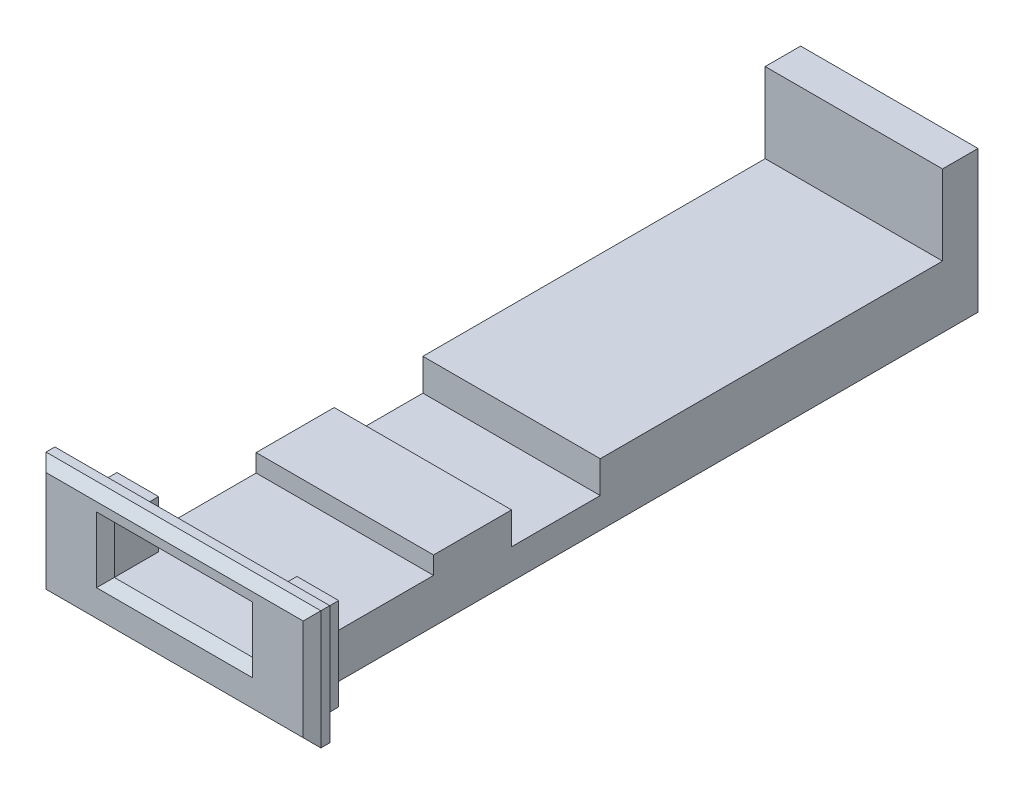
ISO-10303-21;
HEADER;
FILE_DESCRIPTION(('STEP AP214'),'2;1');
FILE_NAME('part.step','',(''),(''),'','','');
FILE_SCHEMA(('AUTOMOTIVE_DESIGN { 1 0 10303 214 1 1 1 1 }'));
ENDSEC;
DATA;
#1=APPLICATION_CONTEXT('core data for automotive mechanical design processes');
#2=APPLICATION_PROTOCOL_DEFINITION('international standard','automotive_design',2000,#1);
#3=PRODUCT_CONTEXT('',#1,'mechanical');
#4=PRODUCT('Part','Part','',(#3));
#5=PRODUCT_RELATED_PRODUCT_CATEGORY('part','',(#4));
#6=PRODUCT_DEFINITION_FORMATION('','',#4);
#7=PRODUCT_DEFINITION_CONTEXT('part definition',#1,'design');
#8=PRODUCT_DEFINITION('design','',#6,#7);
#9=PRODUCT_DEFINITION_SHAPE('','',#8);
#10=(LENGTH_UNIT() NAMED_UNIT(*) SI_UNIT(.MILLI.,.METRE.));
#11=(NAMED_UNIT(*) PLANE_ANGLE_UNIT() SI_UNIT($,.RADIAN.));
#12=(NAMED_UNIT(*) SI_UNIT($,.STERADIAN.) SOLID_ANGLE_UNIT());
#13=UNCERTAINTY_MEASURE_WITH_UNIT(LENGTH_MEASURE(1.E-05),#10,'distance_accuracy_value','');
#14=(GEOMETRIC_REPRESENTATION_CONTEXT(3) GLOBAL_UNCERTAINTY_ASSIGNED_CONTEXT((#13)) GLOBAL_UNIT_ASSIGNED_CONTEXT((#10,
#11,#12)) REPRESENTATION_CONTEXT('',''));
#15=CARTESIAN_POINT('',(0.,0.,0.));
#16=DIRECTION('',(0.,0.,1.));
#17=DIRECTION('',(1.,0.,0.));
#18=AXIS2_PLACEMENT_3D('',#15,#16,#17);
#19=CARTESIAN_POINT('',(7.75,2.5,-3.));
#20=DIRECTION('',(0.,0.,1.));
#21=DIRECTION('',(1.,0.,0.));
#22=AXIS2_PLACEMENT_3D('',#19,#20,#21);
#23=PLANE('',#22);
#24=DIRECTION('',(-1.,0.,0.));
#25=VECTOR('',#24,1.);
#26=CARTESIAN_POINT('',(7.75,5.2,-3.));
#27=LINE('',#26,#25);
#28=CARTESIAN_POINT('',(-3.9,5.2,-3.));
#29=VERTEX_POINT('',#28);
#30=CARTESIAN_POINT('',(-6.24999999999999,5.2,-3.));
#31=VERTEX_POINT('',#30);
#32=EDGE_CURVE('E314',#29,#31,#27,.T.);
#33=ORIENTED_EDGE('',*,*,#32,.F.);
#34=DIRECTION('',(0.,1.,0.));
#35=VECTOR('',#34,1.);
#36=CARTESIAN_POINT('',(-3.9,2.5,-3.));
#37=LINE('',#36,#35);
#38=CARTESIAN_POINT('',(-3.9,2.5,-3.));
#39=VERTEX_POINT('',#38);
#40=EDGE_CURVE('E299',#39,#29,#37,.T.);
#41=ORIENTED_EDGE('',*,*,#40,.F.);
#42=DIRECTION('',(-1.,0.,0.));
#43=VECTOR('',#42,1.);
#44=CARTESIAN_POINT('',(7.75,2.5,-3.));
#45=LINE('',#44,#43);
#46=CARTESIAN_POINT('',(-4.99999999999999,2.5,-3.));
#47=VERTEX_POINT('',#46);
#48=EDGE_CURVE('E328',#39,#47,#45,.T.);
#49=ORIENTED_EDGE('',*,*,#48,.T.);
#50=DIRECTION('',(0.,-1.,0.));
#51=VECTOR('',#50,1.);
#52=CARTESIAN_POINT('',(-4.99999999999999,8.,-3.));
#53=LINE('',#52,#51);
#54=CARTESIAN_POINT('',(-4.99999999999999,0.,-3.));
#55=VERTEX_POINT('',#54);
#56=EDGE_CURVE('E489',#47,#55,#53,.T.);
#57=ORIENTED_EDGE('',*,*,#56,.T.);
#58=DIRECTION('',(-1.,0.,0.));
#59=VECTOR('',#58,1.);
#60=CARTESIAN_POINT('',(-6.24999999999999,0.,-3.));
#61=LINE('',#60,#59);
#62=CARTESIAN_POINT('',(-6.24999999999999,0.,-3.));
#63=VERTEX_POINT('',#62);
#64=EDGE_CURVE('E458',#55,#63,#61,.T.);
#65=ORIENTED_EDGE('',*,*,#64,.T.);
#66=DIRECTION('',(0.,-1.,0.));
#67=VECTOR('',#66,1.);
#68=CARTESIAN_POINT('',(-6.24999999999999,8.,-3.));
#69=LINE('',#68,#67);
#70=EDGE_CURVE('E322',#31,#63,#69,.T.);
#71=ORIENTED_EDGE('',*,*,#70,.F.);
#72=EDGE_LOOP('',(#33,#41,#49,#57,#65,#71));
#73=FACE_BOUND('',#72,.T.);
#74=ADVANCED_FACE('F107',(#73),#23,.F.);
#75=CARTESIAN_POINT('',(7.75,5.2,-3.));
#76=DIRECTION('',(0.,-1.,0.));
#77=DIRECTION('',(0.,0.,-1.));
#78=AXIS2_PLACEMENT_3D('',#75,#76,#77);
#79=PLANE('',#78);
#80=DIRECTION('',(-1.,0.,0.));
#81=VECTOR('',#80,1.);
#82=CARTESIAN_POINT('',(7.75,5.2,-1.));
#83=LINE('',#82,#81);
#84=CARTESIAN_POINT('',(-3.9,5.2,-1.));
#85=VERTEX_POINT('',#84);
#86=CARTESIAN_POINT('',(-6.24999999999999,5.2,-0.999999999999999));
#87=VERTEX_POINT('',#86);
#88=EDGE_CURVE('E316',#85,#87,#83,.T.);
#89=ORIENTED_EDGE('',*,*,#88,.F.);
#90=DIRECTION('',(0.,0.,1.));
#91=VECTOR('',#90,1.);
#92=CARTESIAN_POINT('',(-3.9,5.2,-40.301));
#93=LINE('',#92,#91);
#94=EDGE_CURVE('E302',#29,#85,#93,.T.);
#95=ORIENTED_EDGE('',*,*,#94,.F.);
#96=ORIENTED_EDGE('',*,*,#32,.T.);
#97=DIRECTION('',(0.,0.,1.));
#98=VECTOR('',#97,1.);
#99=CARTESIAN_POINT('',(-6.24999999999999,5.2,-2.99999999999999));
#100=LINE('',#99,#98);
#101=EDGE_CURVE('E494',#31,#87,#100,.T.);
#102=ORIENTED_EDGE('',*,*,#101,.T.);
#103=EDGE_LOOP('',(#89,#95,#96,#102));
#104=FACE_BOUND('',#103,.T.);
#105=ADVANCED_FACE('F312',(#104),#79,.F.);
#106=CARTESIAN_POINT('',(7.75,6.7,0.));
#107=DIRECTION('',(0.,0.,-1.));
#108=DIRECTION('',(0.,1.,0.));
#109=AXIS2_PLACEMENT_3D('',#106,#107,#108);
#110=PLANE('',#109);
#111=DIRECTION('',(0.,1.,0.));
#112=VECTOR('',#111,1.);
#113=CARTESIAN_POINT('',(7.25,6.7,0.));
#114=LINE('',#113,#112);
#115=CARTESIAN_POINT('',(7.25,0.5,0.));
#116=VERTEX_POINT('',#115);
#117=CARTESIAN_POINT('',(7.25,6.2,0.));
#118=VERTEX_POINT('',#117);
#119=EDGE_CURVE('E380',#116,#118,#114,.T.);
#120=ORIENTED_EDGE('',*,*,#119,.T.);
#121=DIRECTION('',(-1.,0.,0.));
#122=VECTOR('',#121,1.);
#123=CARTESIAN_POINT('',(7.75,6.2,0.));
#124=LINE('',#123,#122);
#125=CARTESIAN_POINT('',(-7.25,6.2,0.));
#126=VERTEX_POINT('',#125);
#127=EDGE_CURVE('E382',#118,#126,#124,.T.);
#128=ORIENTED_EDGE('',*,*,#127,.T.);
#129=DIRECTION('',(0.,-1.,0.));
#130=VECTOR('',#129,1.);
#131=CARTESIAN_POINT('',(-7.25,6.7,0.));
#132=LINE('',#131,#130);
#133=CARTESIAN_POINT('',(-7.25,0.5,0.));
#134=VERTEX_POINT('',#133);
#135=EDGE_CURVE('E376',#126,#134,#132,.T.);
#136=ORIENTED_EDGE('',*,*,#135,.T.);
#137=DIRECTION('',(1.,0.,0.));
#138=VECTOR('',#137,1.);
#139=CARTESIAN_POINT('',(7.75,0.5,0.));
#140=LINE('',#139,#138);
#141=EDGE_CURVE('E378',#134,#116,#140,.T.);
#142=ORIENTED_EDGE('',*,*,#141,.T.);
#143=EDGE_LOOP('',(#120,#128,#136,#142));
#144=FACE_BOUND('',#143,.T.);
#145=DIRECTION('',(1.,0.,0.));
#146=VECTOR('',#145,1.);
#147=CARTESIAN_POINT('',(7.75,5.7,0.));
#148=LINE('',#147,#146);
#149=CARTESIAN_POINT('',(-4.4,5.7,0.));
#150=VERTEX_POINT('',#149);
#151=CARTESIAN_POINT('',(4.4,5.7,0.));
#152=VERTEX_POINT('',#151);
#153=EDGE_CURVE('E371',#150,#152,#148,.T.);
#154=ORIENTED_EDGE('',*,*,#153,.T.);
#155=DIRECTION('',(0.,-1.,0.));
#156=VECTOR('',#155,1.);
#157=CARTESIAN_POINT('',(4.4,6.7,0.));
#158=LINE('',#157,#156);
#159=CARTESIAN_POINT('',(4.4,1.99999999999999,0.));
#160=VERTEX_POINT('',#159);
#161=EDGE_CURVE('E373',#152,#160,#158,.T.);
#162=ORIENTED_EDGE('',*,*,#161,.T.);
#163=DIRECTION('',(-1.,0.,0.));
#164=VECTOR('',#163,1.);
#165=CARTESIAN_POINT('',(7.75,1.99999999999999,0.));
#166=LINE('',#165,#164);
#167=CARTESIAN_POINT('',(-4.4,1.99999999999999,0.));
#168=VERTEX_POINT('',#167);
#169=EDGE_CURVE('E367',#160,#168,#166,.T.);
#170=ORIENTED_EDGE('',*,*,#169,.T.);
#171=DIRECTION('',(0.,1.,0.));
#172=VECTOR('',#171,1.);
#173=CARTESIAN_POINT('',(-4.4,6.7,0.));
#174=LINE('',#173,#172);
#175=EDGE_CURVE('E369',#168,#150,#174,.T.);
#176=ORIENTED_EDGE('',*,*,#175,.T.);
#177=EDGE_LOOP('',(#154,#162,#170,#176));
#178=FACE_BOUND('',#177,.T.);
#179=ADVANCED_FACE('F427',(#144,#178),#110,.F.);
#180=CARTESIAN_POINT('',(7.75,0.,0.));
#181=DIRECTION('',(0.,1.,0.));
#182=DIRECTION('',(0.,0.,1.));
#183=AXIS2_PLACEMENT_3D('',#180,#181,#182);
#184=PLANE('',#183);
#185=DIRECTION('',(0.,0.,-1.));
#186=VECTOR('',#185,1.);
#187=CARTESIAN_POINT('',(7.75,0.,0.));
#188=LINE('',#187,#186);
#189=CARTESIAN_POINT('',(7.75,0.,-0.499999999999997));
#190=VERTEX_POINT('',#189);
#191=CARTESIAN_POINT('',(7.75,0.,-1.));
#192=VERTEX_POINT('',#191);
#193=EDGE_CURVE('E545',#190,#192,#188,.T.);
#194=ORIENTED_EDGE('',*,*,#193,.F.);
#195=DIRECTION('',(-1.,0.,0.));
#196=VECTOR('',#195,1.);
#197=CARTESIAN_POINT('',(7.75,0.,-0.499999999999997));
#198=LINE('',#197,#196);
#199=CARTESIAN_POINT('',(-7.75,0.,-0.499999999999997));
#200=VERTEX_POINT('',#199);
#201=EDGE_CURVE('E390',#190,#200,#198,.T.);
#202=ORIENTED_EDGE('',*,*,#201,.T.);
#203=DIRECTION('',(0.,0.,-1.));
#204=VECTOR('',#203,1.);
#205=CARTESIAN_POINT('',(-7.75,0.,0.));
#206=LINE('',#205,#204);
#207=CARTESIAN_POINT('',(-7.75,0.,-1.));
#208=VERTEX_POINT('',#207);
#209=EDGE_CURVE('E544',#200,#208,#206,.T.);
#210=ORIENTED_EDGE('',*,*,#209,.T.);
#211=DIRECTION('',(-1.,0.,0.));
#212=VECTOR('',#211,1.);
#213=CARTESIAN_POINT('',(-7.75,0.,-1.));
#214=LINE('',#213,#212);
#215=CARTESIAN_POINT('',(-6.24999999999999,0.,-0.999999999999999));
#216=VERTEX_POINT('',#215);
#217=EDGE_CURVE('E463',#216,#208,#214,.T.);
#218=ORIENTED_EDGE('',*,*,#217,.F.);
#219=DIRECTION('',(0.,0.,1.));
#220=VECTOR('',#219,1.);
#221=CARTESIAN_POINT('',(-6.24999999999999,0.,-0.999999999999999));
#222=LINE('',#221,#220);
#223=EDGE_CURVE('E460',#63,#216,#222,.T.);
#224=ORIENTED_EDGE('',*,*,#223,.F.);
#225=ORIENTED_EDGE('',*,*,#64,.F.);
#226=DIRECTION('',(0.,0.,1.));
#227=VECTOR('',#226,1.);
#228=CARTESIAN_POINT('',(-4.99999999999999,0.,-3.));
#229=LINE('',#228,#227);
#230=CARTESIAN_POINT('',(-5.,0.,-40.3));
#231=VERTEX_POINT('',#230);
#232=EDGE_CURVE('E455',#231,#55,#229,.T.);
#233=ORIENTED_EDGE('',*,*,#232,.F.);
#234=DIRECTION('',(-1.,0.,0.));
#235=VECTOR('',#234,1.);
#236=CARTESIAN_POINT('',(7.75,0.,-40.3));
#237=LINE('',#236,#235);
#238=CARTESIAN_POINT('',(5.,0.,-40.3));
#239=VERTEX_POINT('',#238);
#240=EDGE_CURVE('E364',#239,#231,#237,.T.);
#241=ORIENTED_EDGE('',*,*,#240,.F.);
#242=DIRECTION('',(0.,0.,-1.));
#243=VECTOR('',#242,1.);
#244=CARTESIAN_POINT('',(5.,0.,-3.));
#245=LINE('',#244,#243);
#246=CARTESIAN_POINT('',(5.,0.,-3.));
#247=VERTEX_POINT('',#246);
#248=EDGE_CURVE('E451',#247,#239,#245,.T.);
#249=ORIENTED_EDGE('',*,*,#248,.F.);
#250=DIRECTION('',(-1.,0.,0.));
#251=VECTOR('',#250,1.);
#252=CARTESIAN_POINT('',(6.25,0.,-3.));
#253=LINE('',#252,#251);
#254=CARTESIAN_POINT('',(6.25,0.,-3.));
#255=VERTEX_POINT('',#254);
#256=EDGE_CURVE('E472',#255,#247,#253,.T.);
#257=ORIENTED_EDGE('',*,*,#256,.F.);
#258=DIRECTION('',(0.,0.,-1.));
#259=VECTOR('',#258,1.);
#260=CARTESIAN_POINT('',(6.25,0.,-1.));
#261=LINE('',#260,#259);
#262=CARTESIAN_POINT('',(6.25,0.,-1.));
#263=VERTEX_POINT('',#262);
#264=EDGE_CURVE('E469',#263,#255,#261,.T.);
#265=ORIENTED_EDGE('',*,*,#264,.F.);
#266=DIRECTION('',(-1.,0.,0.));
#267=VECTOR('',#266,1.);
#268=CARTESIAN_POINT('',(7.75,0.,-1.));
#269=LINE('',#268,#267);
#270=EDGE_CURVE('E466',#192,#263,#269,.T.);
#271=ORIENTED_EDGE('',*,*,#270,.F.);
#272=EDGE_LOOP('',(#194,#202,#210,#218,#224,#225,#233,#241,#249,#257,#265,#271));
#273=FACE_BOUND('',#272,.T.);
#274=ADVANCED_FACE('F588',(#273),#184,.F.);
#275=CARTESIAN_POINT('',(7.75,0.,-40.3));
#276=DIRECTION('',(0.,0.,1.));
#277=DIRECTION('',(1.,0.,0.));
#278=AXIS2_PLACEMENT_3D('',#275,#276,#277);
#279=PLANE('',#278);
#280=ORIENTED_EDGE('',*,*,#240,.T.);
#281=DIRECTION('',(0.,-1.,0.));
#282=VECTOR('',#281,1.);
#283=CARTESIAN_POINT('',(-5.,8.,-40.3));
#284=LINE('',#283,#282);
#285=CARTESIAN_POINT('',(-5.,8.,-40.3));
#286=VERTEX_POINT('',#285);
#287=EDGE_CURVE('E454',#286,#231,#284,.T.);
#288=ORIENTED_EDGE('',*,*,#287,.F.);
#289=DIRECTION('',(-1.,0.,0.));
#290=VECTOR('',#289,1.);
#291=CARTESIAN_POINT('',(7.75,8.,-40.3));
#292=LINE('',#291,#290);
#293=CARTESIAN_POINT('',(5.,8.,-40.3));
#294=VERTEX_POINT('',#293);
#295=EDGE_CURVE('E361',#294,#286,#292,.T.);
#296=ORIENTED_EDGE('',*,*,#295,.F.);
#297=DIRECTION('',(0.,-1.,0.));
#298=VECTOR('',#297,1.);
#299=CARTESIAN_POINT('',(5.,8.,-40.3));
#300=LINE('',#299,#298);
#301=EDGE_CURVE('E477',#294,#239,#300,.T.);
#302=ORIENTED_EDGE('',*,*,#301,.T.);
#303=EDGE_LOOP('',(#280,#288,#296,#302));
#304=FACE_BOUND('',#303,.T.);
#305=ADVANCED_FACE('F680',(#304),#279,.F.);
#306=CARTESIAN_POINT('',(7.75,8.,-40.3));
#307=DIRECTION('',(0.,-1.,0.));
#308=DIRECTION('',(0.,0.,-1.));
#309=AXIS2_PLACEMENT_3D('',#306,#307,#308);
#310=PLANE('',#309);
#311=ORIENTED_EDGE('',*,*,#295,.T.);
#312=DIRECTION('',(0.,0.,1.));
#313=VECTOR('',#312,1.);
#314=CARTESIAN_POINT('',(-4.99999999999999,8.,-3.));
#315=LINE('',#314,#313);
#316=CARTESIAN_POINT('',(-5.,8.,-38.3));
#317=VERTEX_POINT('',#316);
#318=EDGE_CURVE('E447',#286,#317,#315,.T.);
#319=ORIENTED_EDGE('',*,*,#318,.T.);
#320=DIRECTION('',(-1.,0.,0.));
#321=VECTOR('',#320,1.);
#322=CARTESIAN_POINT('',(7.75,8.,-38.3));
#323=LINE('',#322,#321);
#324=CARTESIAN_POINT('',(5.,8.,-38.3));
#325=VERTEX_POINT('',#324);
#326=EDGE_CURVE('E358',#325,#317,#323,.T.);
#327=ORIENTED_EDGE('',*,*,#326,.F.);
#328=DIRECTION('',(0.,0.,-1.));
#329=VECTOR('',#328,1.);
#330=CARTESIAN_POINT('',(5.,8.,-3.));
#331=LINE('',#330,#329);
#332=EDGE_CURVE('E450',#325,#294,#331,.T.);
#333=ORIENTED_EDGE('',*,*,#332,.T.);
#334=EDGE_LOOP('',(#311,#319,#327,#333));
#335=FACE_BOUND('',#334,.T.);
#336=ADVANCED_FACE('F676',(#335),#310,.F.);
#337=CARTESIAN_POINT('',(7.75,8.,-38.3));
#338=DIRECTION('',(0.,0.,-1.));
#339=DIRECTION('',(-1.,0.,0.));
#340=AXIS2_PLACEMENT_3D('',#337,#338,#339);
#341=PLANE('',#340);
#342=ORIENTED_EDGE('',*,*,#326,.T.);
#343=DIRECTION('',(0.,-1.,0.));
#344=VECTOR('',#343,1.);
#345=CARTESIAN_POINT('',(-5.,8.,-38.3));
#346=LINE('',#345,#344);
#347=CARTESIAN_POINT('',(-5.,3.5,-38.3));
#348=VERTEX_POINT('',#347);
#349=EDGE_CURVE('E541',#317,#348,#346,.T.);
#350=ORIENTED_EDGE('',*,*,#349,.T.);
#351=DIRECTION('',(-1.,0.,0.));
#352=VECTOR('',#351,1.);
#353=CARTESIAN_POINT('',(7.75,3.5,-38.3));
#354=LINE('',#353,#352);
#355=CARTESIAN_POINT('',(5.,3.5,-38.3));
#356=VERTEX_POINT('',#355);
#357=EDGE_CURVE('E355',#356,#348,#354,.T.);
#358=ORIENTED_EDGE('',*,*,#357,.F.);
#359=DIRECTION('',(0.,1.,0.));
#360=VECTOR('',#359,1.);
#361=CARTESIAN_POINT('',(5.,8.,-38.3));
#362=LINE('',#361,#360);
#363=EDGE_CURVE('E517',#356,#325,#362,.T.);
#364=ORIENTED_EDGE('',*,*,#363,.T.);
#365=EDGE_LOOP('',(#342,#350,#358,#364));
#366=FACE_BOUND('',#365,.T.);
#367=ADVANCED_FACE('F672',(#366),#341,.F.);
#368=CARTESIAN_POINT('',(7.75,3.5,-38.3));
#369=DIRECTION('',(0.,-1.,0.));
#370=DIRECTION('',(0.,0.,-1.));
#371=AXIS2_PLACEMENT_3D('',#368,#369,#370);
#372=PLANE('',#371);
#373=ORIENTED_EDGE('',*,*,#357,.T.);
#374=DIRECTION('',(0.,0.,1.));
#375=VECTOR('',#374,1.);
#376=CARTESIAN_POINT('',(-5.,3.5,-38.3));
#377=LINE('',#376,#375);
#378=CARTESIAN_POINT('',(-4.99999999999999,3.5,-19.));
#379=VERTEX_POINT('',#378);
#380=EDGE_CURVE('E538',#348,#379,#377,.T.);
#381=ORIENTED_EDGE('',*,*,#380,.T.);
#382=DIRECTION('',(-1.,0.,0.));
#383=VECTOR('',#382,1.);
#384=CARTESIAN_POINT('',(7.75,3.5,-19.));
#385=LINE('',#384,#383);
#386=CARTESIAN_POINT('',(5.,3.5,-19.));
#387=VERTEX_POINT('',#386);
#388=EDGE_CURVE('E352',#387,#379,#385,.T.);
#389=ORIENTED_EDGE('',*,*,#388,.F.);
#390=DIRECTION('',(0.,0.,-1.));
#391=VECTOR('',#390,1.);
#392=CARTESIAN_POINT('',(5.,3.5,-38.3));
#393=LINE('',#392,#391);
#394=EDGE_CURVE('E514',#387,#356,#393,.T.);
#395=ORIENTED_EDGE('',*,*,#394,.T.);
#396=EDGE_LOOP('',(#373,#381,#389,#395));
#397=FACE_BOUND('',#396,.T.);
#398=ADVANCED_FACE('F668',(#397),#372,.F.);
#399=CARTESIAN_POINT('',(7.75,3.5,-19.));
#400=DIRECTION('',(0.,0.,-1.));
#401=DIRECTION('',(0.,1.,0.));
#402=AXIS2_PLACEMENT_3D('',#399,#400,#401);
#403=PLANE('',#402);
#404=ORIENTED_EDGE('',*,*,#388,.T.);
#405=DIRECTION('',(0.,-1.,0.));
#406=VECTOR('',#405,1.);
#407=CARTESIAN_POINT('',(-4.99999999999999,3.5,-19.));
#408=LINE('',#407,#406);
#409=CARTESIAN_POINT('',(-4.99999999999999,1.7,-19.));
#410=VERTEX_POINT('',#409);
#411=EDGE_CURVE('E535',#379,#410,#408,.T.);
#412=ORIENTED_EDGE('',*,*,#411,.T.);
#413=DIRECTION('',(-1.,0.,0.));
#414=VECTOR('',#413,1.);
#415=CARTESIAN_POINT('',(7.75,1.7,-19.));
#416=LINE('',#415,#414);
#417=CARTESIAN_POINT('',(5.,1.7,-19.));
#418=VERTEX_POINT('',#417);
#419=EDGE_CURVE('E349',#418,#410,#416,.T.);
#420=ORIENTED_EDGE('',*,*,#419,.F.);
#421=DIRECTION('',(0.,1.,0.));
#422=VECTOR('',#421,1.);
#423=CARTESIAN_POINT('',(5.,3.5,-19.));
#424=LINE('',#423,#422);
#425=EDGE_CURVE('E511',#418,#387,#424,.T.);
#426=ORIENTED_EDGE('',*,*,#425,.T.);
#427=EDGE_LOOP('',(#404,#412,#420,#426));
#428=FACE_BOUND('',#427,.T.);
#429=ADVANCED_FACE('F664',(#428),#403,.F.);
#430=CARTESIAN_POINT('',(7.75,1.7,-19.));
#431=DIRECTION('',(0.,-1.,0.));
#432=DIRECTION('',(0.,0.,-1.));
#433=AXIS2_PLACEMENT_3D('',#430,#431,#432);
#434=PLANE('',#433);
#435=ORIENTED_EDGE('',*,*,#419,.T.);
#436=DIRECTION('',(0.,0.,1.));
#437=VECTOR('',#436,1.);
#438=CARTESIAN_POINT('',(-4.99999999999999,1.7,-19.));
#439=LINE('',#438,#437);
#440=CARTESIAN_POINT('',(-4.99999999999999,1.7,-14.));
#441=VERTEX_POINT('',#440);
#442=EDGE_CURVE('E532',#410,#441,#439,.T.);
#443=ORIENTED_EDGE('',*,*,#442,.T.);
#444=DIRECTION('',(-1.,0.,0.));
#445=VECTOR('',#444,1.);
#446=CARTESIAN_POINT('',(7.75,1.7,-14.));
#447=LINE('',#446,#445);
#448=CARTESIAN_POINT('',(5.,1.7,-14.));
#449=VERTEX_POINT('',#448);
#450=EDGE_CURVE('E346',#449,#441,#447,.T.);
#451=ORIENTED_EDGE('',*,*,#450,.F.);
#452=DIRECTION('',(0.,0.,-1.));
#453=VECTOR('',#452,1.);
#454=CARTESIAN_POINT('',(5.,1.7,-19.));
#455=LINE('',#454,#453);
#456=EDGE_CURVE('E508',#449,#418,#455,.T.);
#457=ORIENTED_EDGE('',*,*,#456,.T.);
#458=EDGE_LOOP('',(#435,#443,#451,#457));
#459=FACE_BOUND('',#458,.T.);
#460=ADVANCED_FACE('F660',(#459),#434,.F.);
#461=CARTESIAN_POINT('',(7.75,1.7,-14.));
#462=DIRECTION('',(0.,0.,1.));
#463=DIRECTION('',(0.,-1.,0.));
#464=AXIS2_PLACEMENT_3D('',#461,#462,#463);
#465=PLANE('',#464);
#466=ORIENTED_EDGE('',*,*,#450,.T.);
#467=DIRECTION('',(0.,1.,0.));
#468=VECTOR('',#467,1.);
#469=CARTESIAN_POINT('',(-4.99999999999999,1.7,-14.));
#470=LINE('',#469,#468);
#471=CARTESIAN_POINT('',(-4.99999999999999,3.5,-14.));
#472=VERTEX_POINT('',#471);
#473=EDGE_CURVE('E529',#441,#472,#470,.T.);
#474=ORIENTED_EDGE('',*,*,#473,.T.);
#475=DIRECTION('',(-1.,0.,0.));
#476=VECTOR('',#475,1.);
#477=CARTESIAN_POINT('',(7.75,3.5,-14.));
#478=LINE('',#477,#476);
#479=CARTESIAN_POINT('',(5.,3.5,-14.));
#480=VERTEX_POINT('',#479);
#481=EDGE_CURVE('E343',#480,#472,#478,.T.);
#482=ORIENTED_EDGE('',*,*,#481,.F.);
#483=DIRECTION('',(0.,-1.,0.));
#484=VECTOR('',#483,1.);
#485=CARTESIAN_POINT('',(5.,1.7,-14.));
#486=LINE('',#485,#484);
#487=EDGE_CURVE('E505',#480,#449,#486,.T.);
#488=ORIENTED_EDGE('',*,*,#487,.T.);
#489=EDGE_LOOP('',(#466,#474,#482,#488));
#490=FACE_BOUND('',#489,.T.);
#491=ADVANCED_FACE('F656',(#490),#465,.F.);
#492=CARTESIAN_POINT('',(7.75,3.5,-14.));
#493=DIRECTION('',(0.,-1.,0.));
#494=DIRECTION('',(0.,0.,-1.));
#495=AXIS2_PLACEMENT_3D('',#492,#493,#494);
#496=PLANE('',#495);
#497=ORIENTED_EDGE('',*,*,#481,.T.);
#498=DIRECTION('',(0.,0.,1.));
#499=VECTOR('',#498,1.);
#500=CARTESIAN_POINT('',(-4.99999999999999,3.5,-14.));
#501=LINE('',#500,#499);
#502=CARTESIAN_POINT('',(-4.99999999999999,3.5,-9.6));
#503=VERTEX_POINT('',#502);
#504=EDGE_CURVE('E526',#472,#503,#501,.T.);
#505=ORIENTED_EDGE('',*,*,#504,.T.);
#506=DIRECTION('',(-1.,0.,0.));
#507=VECTOR('',#506,1.);
#508=CARTESIAN_POINT('',(7.75,3.5,-9.6));
#509=LINE('',#508,#507);
#510=CARTESIAN_POINT('',(5.,3.5,-9.6));
#511=VERTEX_POINT('',#510);
#512=EDGE_CURVE('E340',#511,#503,#509,.T.);
#513=ORIENTED_EDGE('',*,*,#512,.F.);
#514=DIRECTION('',(0.,0.,-1.));
#515=VECTOR('',#514,1.);
#516=CARTESIAN_POINT('',(5.,3.5,-14.));
#517=LINE('',#516,#515);
#518=EDGE_CURVE('E502',#511,#480,#517,.T.);
#519=ORIENTED_EDGE('',*,*,#518,.T.);
#520=EDGE_LOOP('',(#497,#505,#513,#519));
#521=FACE_BOUND('',#520,.T.);
#522=ADVANCED_FACE('F650',(#521),#496,.F.);
#523=CARTESIAN_POINT('',(7.75,3.5,-9.6));
#524=DIRECTION('',(0.,0.,-1.));
#525=DIRECTION('',(-1.,0.,0.));
#526=AXIS2_PLACEMENT_3D('',#523,#524,#525);
#527=PLANE('',#526);
#528=ORIENTED_EDGE('',*,*,#512,.T.);
#529=DIRECTION('',(0.,-1.,0.));
#530=VECTOR('',#529,1.);
#531=CARTESIAN_POINT('',(-4.99999999999999,3.5,-9.6));
#532=LINE('',#531,#530);
#533=CARTESIAN_POINT('',(-4.99999999999999,2.5,-9.6));
#534=VERTEX_POINT('',#533);
#535=EDGE_CURVE('E523',#503,#534,#532,.T.);
#536=ORIENTED_EDGE('',*,*,#535,.T.);
#537=DIRECTION('',(-1.,0.,0.));
#538=VECTOR('',#537,1.);
#539=CARTESIAN_POINT('',(7.75,2.5,-9.6));
#540=LINE('',#539,#538);
#541=CARTESIAN_POINT('',(5.,2.5,-9.6));
#542=VERTEX_POINT('',#541);
#543=EDGE_CURVE('E337',#542,#534,#540,.T.);
#544=ORIENTED_EDGE('',*,*,#543,.F.);
#545=DIRECTION('',(0.,1.,0.));
#546=VECTOR('',#545,1.);
#547=CARTESIAN_POINT('',(5.,3.5,-9.6));
#548=LINE('',#547,#546);
#549=EDGE_CURVE('E499',#542,#511,#548,.T.);
#550=ORIENTED_EDGE('',*,*,#549,.T.);
#551=EDGE_LOOP('',(#528,#536,#544,#550));
#552=FACE_BOUND('',#551,.T.);
#553=ADVANCED_FACE('F646',(#552),#527,.F.);
#554=CARTESIAN_POINT('',(7.75,2.5,-9.6));
#555=DIRECTION('',(0.,-1.,0.));
#556=DIRECTION('',(0.,0.,-1.));
#557=AXIS2_PLACEMENT_3D('',#554,#555,#556);
#558=PLANE('',#557);
#559=DIRECTION('',(0.,0.,1.));
#560=VECTOR('',#559,1.);
#561=CARTESIAN_POINT('',(-3.9,2.5,-40.301));
#562=LINE('',#561,#560);
#563=CARTESIAN_POINT('',(-3.9,2.5,-0.5));
#564=VERTEX_POINT('',#563);
#565=EDGE_CURVE('E303',#39,#564,#562,.T.);
#566=ORIENTED_EDGE('',*,*,#565,.T.);
#567=DIRECTION('',(1.,0.,0.));
#568=VECTOR('',#567,1.);
#569=CARTESIAN_POINT('',(7.75,2.5,-0.5));
#570=LINE('',#569,#568);
#571=CARTESIAN_POINT('',(3.9,2.5,-0.5));
#572=VERTEX_POINT('',#571);
#573=EDGE_CURVE('E12',#564,#572,#570,.T.);
#574=ORIENTED_EDGE('',*,*,#573,.T.);
#575=DIRECTION('',(0.,0.,1.));
#576=VECTOR('',#575,1.);
#577=CARTESIAN_POINT('',(3.9,2.5,-40.301));
#578=LINE('',#577,#576);
#579=CARTESIAN_POINT('',(3.9,2.5,-3.));
#580=VERTEX_POINT('',#579);
#581=EDGE_CURVE('E308',#580,#572,#578,.T.);
#582=ORIENTED_EDGE('',*,*,#581,.F.);
#583=CARTESIAN_POINT('',(5.,2.5,-3.));
#584=VERTEX_POINT('',#583);
#585=EDGE_CURVE('E334',#584,#580,#45,.T.);
#586=ORIENTED_EDGE('',*,*,#585,.F.);
#587=DIRECTION('',(0.,0.,-1.));
#588=VECTOR('',#587,1.);
#589=CARTESIAN_POINT('',(5.,2.5,-9.6));
#590=LINE('',#589,#588);
#591=EDGE_CURVE('E496',#584,#542,#590,.T.);
#592=ORIENTED_EDGE('',*,*,#591,.T.);
#593=ORIENTED_EDGE('',*,*,#543,.T.);
#594=DIRECTION('',(0.,0.,1.));
#595=VECTOR('',#594,1.);
#596=CARTESIAN_POINT('',(-4.99999999999999,2.5,-9.6));
#597=LINE('',#596,#595);
#598=EDGE_CURVE('E520',#534,#47,#597,.T.);
#599=ORIENTED_EDGE('',*,*,#598,.T.);
#600=ORIENTED_EDGE('',*,*,#48,.F.);
#601=EDGE_LOOP('',(#566,#574,#582,#586,#592,#593,#599,#600));
#602=FACE_BOUND('',#601,.T.);
#603=ADVANCED_FACE('F576',(#602),#558,.F.);
#604=ORIENTED_EDGE('',*,*,#585,.T.);
#605=DIRECTION('',(0.,-1.,0.));
#606=VECTOR('',#605,1.);
#607=CARTESIAN_POINT('',(3.9,2.5,-3.));
#608=LINE('',#607,#606);
#609=CARTESIAN_POINT('',(3.9,5.2,-3.));
#610=VERTEX_POINT('',#609);
#611=EDGE_CURVE('E307',#610,#580,#608,.T.);
#612=ORIENTED_EDGE('',*,*,#611,.F.);
#613=CARTESIAN_POINT('',(6.25,5.2,-3.));
#614=VERTEX_POINT('',#613);
#615=EDGE_CURVE('E324',#614,#610,#27,.T.);
#616=ORIENTED_EDGE('',*,*,#615,.F.);
#617=DIRECTION('',(0.,-1.,0.));
#618=VECTOR('',#617,1.);
#619=CARTESIAN_POINT('',(6.25,8.,-3.));
#620=LINE('',#619,#618);
#621=EDGE_CURVE('E482',#614,#255,#620,.T.);
#622=ORIENTED_EDGE('',*,*,#621,.T.);
#623=ORIENTED_EDGE('',*,*,#256,.T.);
#624=DIRECTION('',(0.,-1.,0.));
#625=VECTOR('',#624,1.);
#626=CARTESIAN_POINT('',(5.,8.,-3.));
#627=LINE('',#626,#625);
#628=EDGE_CURVE('E480',#584,#247,#627,.T.);
#629=ORIENTED_EDGE('',*,*,#628,.F.);
#630=EDGE_LOOP('',(#604,#612,#616,#622,#623,#629));
#631=FACE_BOUND('',#630,.T.);
#632=ADVANCED_FACE('F572',(#631),#23,.F.);
#633=ORIENTED_EDGE('',*,*,#615,.T.);
#634=DIRECTION('',(0.,0.,1.));
#635=VECTOR('',#634,1.);
#636=CARTESIAN_POINT('',(3.9,5.2,-40.301));
#637=LINE('',#636,#635);
#638=CARTESIAN_POINT('',(3.9,5.2,-1.));
#639=VERTEX_POINT('',#638);
#640=EDGE_CURVE('E441',#610,#639,#637,.T.);
#641=ORIENTED_EDGE('',*,*,#640,.T.);
#642=CARTESIAN_POINT('',(6.25,5.2,-1.));
#643=VERTEX_POINT('',#642);
#644=EDGE_CURVE('E325',#643,#639,#83,.T.);
#645=ORIENTED_EDGE('',*,*,#644,.F.);
#646=DIRECTION('',(0.,0.,-1.));
#647=VECTOR('',#646,1.);
#648=CARTESIAN_POINT('',(6.25,5.2,-3.));
#649=LINE('',#648,#647);
#650=EDGE_CURVE('E491',#643,#614,#649,.T.);
#651=ORIENTED_EDGE('',*,*,#650,.T.);
#652=EDGE_LOOP('',(#633,#641,#645,#651));
#653=FACE_BOUND('',#652,.T.);
#654=ADVANCED_FACE('F568',(#653),#79,.F.);
#655=CARTESIAN_POINT('',(7.75,5.2,-1.));
#656=DIRECTION('',(0.,0.,1.));
#657=DIRECTION('',(0.,-1.,0.));
#658=AXIS2_PLACEMENT_3D('',#655,#656,#657);
#659=PLANE('',#658);
#660=ORIENTED_EDGE('',*,*,#644,.T.);
#661=EDGE_CURVE('E330',#639,#85,#83,.T.);
#662=ORIENTED_EDGE('',*,*,#661,.T.);
#663=ORIENTED_EDGE('',*,*,#88,.T.);
#664=DIRECTION('',(0.,-1.,0.));
#665=VECTOR('',#664,1.);
#666=CARTESIAN_POINT('',(-6.24999999999999,8.,-0.999999999999999));
#667=LINE('',#666,#665);
#668=EDGE_CURVE('E486',#87,#216,#667,.T.);
#669=ORIENTED_EDGE('',*,*,#668,.T.);
#670=ORIENTED_EDGE('',*,*,#217,.T.);
#671=DIRECTION('',(0.,1.,0.));
#672=VECTOR('',#671,1.);
#673=CARTESIAN_POINT('',(-7.75,5.2,-1.));
#674=LINE('',#673,#672);
#675=CARTESIAN_POINT('',(-7.75,6.7,-1.));
#676=VERTEX_POINT('',#675);
#677=EDGE_CURVE('E555',#208,#676,#674,.T.);
#678=ORIENTED_EDGE('',*,*,#677,.T.);
#679=DIRECTION('',(-1.,0.,0.));
#680=VECTOR('',#679,1.);
#681=CARTESIAN_POINT('',(7.75,6.7,-1.));
#682=LINE('',#681,#680);
#683=CARTESIAN_POINT('',(7.75,6.7,-1.));
#684=VERTEX_POINT('',#683);
#685=EDGE_CURVE('E553',#684,#676,#682,.T.);
#686=ORIENTED_EDGE('',*,*,#685,.F.);
#687=DIRECTION('',(0.,1.,0.));
#688=VECTOR('',#687,1.);
#689=CARTESIAN_POINT('',(7.75,5.2,-1.));
#690=LINE('',#689,#688);
#691=EDGE_CURVE('E547',#192,#684,#690,.T.);
#692=ORIENTED_EDGE('',*,*,#691,.F.);
#693=ORIENTED_EDGE('',*,*,#270,.T.);
#694=DIRECTION('',(0.,-1.,0.));
#695=VECTOR('',#694,1.);
#696=CARTESIAN_POINT('',(6.25,8.,-1.));
#697=LINE('',#696,#695);
#698=EDGE_CURVE('E484',#643,#263,#697,.T.);
#699=ORIENTED_EDGE('',*,*,#698,.F.);
#700=EDGE_LOOP('',(#660,#662,#663,#669,#670,#678,#686,#692,#693,#699));
#701=FACE_BOUND('',#700,.T.);
#702=ADVANCED_FACE('F564',(#701),#659,.F.);
#703=CARTESIAN_POINT('',(7.75,6.7,-1.));
#704=DIRECTION('',(0.,-1.,0.));
#705=DIRECTION('',(0.,0.,-1.));
#706=AXIS2_PLACEMENT_3D('',#703,#704,#705);
#707=PLANE('',#706);
#708=DIRECTION('',(0.,0.,1.));
#709=VECTOR('',#708,1.);
#710=CARTESIAN_POINT('',(-7.75,6.7,-1.));
#711=LINE('',#710,#709);
#712=CARTESIAN_POINT('',(-7.75,6.7,-0.499999999999997));
#713=VERTEX_POINT('',#712);
#714=EDGE_CURVE('E548',#676,#713,#711,.T.);
#715=ORIENTED_EDGE('',*,*,#714,.T.);
#716=DIRECTION('',(1.,0.,0.));
#717=VECTOR('',#716,1.);
#718=CARTESIAN_POINT('',(7.75,6.7,-0.499999999999997));
#719=LINE('',#718,#717);
#720=CARTESIAN_POINT('',(7.75,6.7,-0.499999999999997));
#721=VERTEX_POINT('',#720);
#722=EDGE_CURVE('E385',#713,#721,#719,.T.);
#723=ORIENTED_EDGE('',*,*,#722,.T.);
#724=DIRECTION('',(0.,0.,1.));
#725=VECTOR('',#724,1.);
#726=CARTESIAN_POINT('',(7.75,6.7,-1.));
#727=LINE('',#726,#725);
#728=EDGE_CURVE('E550',#684,#721,#727,.T.);
#729=ORIENTED_EDGE('',*,*,#728,.F.);
#730=ORIENTED_EDGE('',*,*,#685,.T.);
#731=EDGE_LOOP('',(#715,#723,#729,#730));
#732=FACE_BOUND('',#731,.T.);
#733=ADVANCED_FACE('F600',(#732),#707,.F.);
#734=CARTESIAN_POINT('',(7.75,0.,0.));
#735=DIRECTION('',(1.,0.,0.));
#736=DIRECTION('',(0.,0.,-1.));
#737=AXIS2_PLACEMENT_3D('',#734,#735,#736);
#738=PLANE('',#737);
#739=ORIENTED_EDGE('',*,*,#728,.T.);
#740=DIRECTION('',(0.,-1.,0.));
#741=VECTOR('',#740,1.);
#742=CARTESIAN_POINT('',(7.75,0.,-0.499999999999997));
#743=LINE('',#742,#741);
#744=EDGE_CURVE('E388',#721,#190,#743,.T.);
#745=ORIENTED_EDGE('',*,*,#744,.T.);
#746=ORIENTED_EDGE('',*,*,#193,.T.);
#747=ORIENTED_EDGE('',*,*,#691,.T.);
#748=EDGE_LOOP('',(#739,#745,#746,#747));
#749=FACE_BOUND('',#748,.T.);
#750=ADVANCED_FACE('F618',(#749),#738,.T.);
#751=CARTESIAN_POINT('',(-7.75,0.,0.));
#752=DIRECTION('',(1.,0.,0.));
#753=DIRECTION('',(0.,0.,-1.));
#754=AXIS2_PLACEMENT_3D('',#751,#752,#753);
#755=PLANE('',#754);
#756=ORIENTED_EDGE('',*,*,#209,.F.);
#757=DIRECTION('',(0.,1.,0.));
#758=VECTOR('',#757,1.);
#759=CARTESIAN_POINT('',(-7.75,0.,-0.499999999999997));
#760=LINE('',#759,#758);
#761=EDGE_CURVE('E392',#200,#713,#760,.T.);
#762=ORIENTED_EDGE('',*,*,#761,.T.);
#763=ORIENTED_EDGE('',*,*,#714,.F.);
#764=ORIENTED_EDGE('',*,*,#677,.F.);
#765=EDGE_LOOP('',(#756,#762,#763,#764));
#766=FACE_BOUND('',#765,.T.);
#767=ADVANCED_FACE('F597',(#766),#755,.F.);
#768=CARTESIAN_POINT('',(-6.24999999999999,8.,-0.999999999999999));
#769=DIRECTION('',(1.,0.,0.));
#770=DIRECTION('',(0.,0.,-1.));
#771=AXIS2_PLACEMENT_3D('',#768,#769,#770);
#772=PLANE('',#771);
#773=ORIENTED_EDGE('',*,*,#101,.F.);
#774=ORIENTED_EDGE('',*,*,#70,.T.);
#775=ORIENTED_EDGE('',*,*,#223,.T.);
#776=ORIENTED_EDGE('',*,*,#668,.F.);
#777=EDGE_LOOP('',(#773,#774,#775,#776));
#778=FACE_BOUND('',#777,.T.);
#779=ADVANCED_FACE('F591',(#778),#772,.F.);
#780=CARTESIAN_POINT('',(-4.99999999999999,8.,-3.));
#781=DIRECTION('',(1.,0.,0.));
#782=DIRECTION('',(0.,0.,-1.));
#783=AXIS2_PLACEMENT_3D('',#780,#781,#782);
#784=PLANE('',#783);
#785=ORIENTED_EDGE('',*,*,#318,.F.);
#786=ORIENTED_EDGE('',*,*,#287,.T.);
#787=ORIENTED_EDGE('',*,*,#232,.T.);
#788=ORIENTED_EDGE('',*,*,#56,.F.);
#789=ORIENTED_EDGE('',*,*,#598,.F.);
#790=ORIENTED_EDGE('',*,*,#535,.F.);
#791=ORIENTED_EDGE('',*,*,#504,.F.);
#792=ORIENTED_EDGE('',*,*,#473,.F.);
#793=ORIENTED_EDGE('',*,*,#442,.F.);
#794=ORIENTED_EDGE('',*,*,#411,.F.);
#795=ORIENTED_EDGE('',*,*,#380,.F.);
#796=ORIENTED_EDGE('',*,*,#349,.F.);
#797=EDGE_LOOP('',(#785,#786,#787,#788,#789,#790,#791,#792,#793,#794,#795,#796));
#798=FACE_BOUND('',#797,.T.);
#799=ADVANCED_FACE('F580',(#798),#784,.F.);
#800=CARTESIAN_POINT('',(5.,8.,-3.));
#801=DIRECTION('',(-1.,0.,0.));
#802=DIRECTION('',(0.,0.,1.));
#803=AXIS2_PLACEMENT_3D('',#800,#801,#802);
#804=PLANE('',#803);
#805=ORIENTED_EDGE('',*,*,#394,.F.);
#806=ORIENTED_EDGE('',*,*,#425,.F.);
#807=ORIENTED_EDGE('',*,*,#456,.F.);
#808=ORIENTED_EDGE('',*,*,#487,.F.);
#809=ORIENTED_EDGE('',*,*,#518,.F.);
#810=ORIENTED_EDGE('',*,*,#549,.F.);
#811=ORIENTED_EDGE('',*,*,#591,.F.);
#812=ORIENTED_EDGE('',*,*,#628,.T.);
#813=ORIENTED_EDGE('',*,*,#248,.T.);
#814=ORIENTED_EDGE('',*,*,#301,.F.);
#815=ORIENTED_EDGE('',*,*,#332,.F.);
#816=ORIENTED_EDGE('',*,*,#363,.F.);
#817=EDGE_LOOP('',(#805,#806,#807,#808,#809,#810,#811,#812,#813,#814,#815,#816));
#818=FACE_BOUND('',#817,.T.);
#819=ADVANCED_FACE('F888',(#818),#804,.F.);
#820=CARTESIAN_POINT('',(6.25,8.,-1.));
#821=DIRECTION('',(-1.,0.,0.));
#822=DIRECTION('',(0.,0.,1.));
#823=AXIS2_PLACEMENT_3D('',#820,#821,#822);
#824=PLANE('',#823);
#825=ORIENTED_EDGE('',*,*,#698,.T.);
#826=ORIENTED_EDGE('',*,*,#264,.T.);
#827=ORIENTED_EDGE('',*,*,#621,.F.);
#828=ORIENTED_EDGE('',*,*,#650,.F.);
#829=EDGE_LOOP('',(#825,#826,#827,#828));
#830=FACE_BOUND('',#829,.T.);
#831=ADVANCED_FACE('F772',(#830),#824,.F.);
#832=CARTESIAN_POINT('',(-3.9,5.2,-40.301));
#833=DIRECTION('',(0.,1.,0.));
#834=DIRECTION('',(0.,0.,1.));
#835=AXIS2_PLACEMENT_3D('',#832,#833,#834);
#836=PLANE('',#835);
#837=CARTESIAN_POINT('',(3.9,5.2,-0.5));
#838=VERTEX_POINT('',#837);
#839=EDGE_CURVE('E318',#639,#838,#637,.T.);
#840=ORIENTED_EDGE('',*,*,#839,.T.);
#841=DIRECTION('',(-1.,0.,0.));
#842=VECTOR('',#841,1.);
#843=CARTESIAN_POINT('',(-3.9,5.2,-0.5));
#844=LINE('',#843,#842);
#845=CARTESIAN_POINT('',(-3.9,5.2,-0.5));
#846=VERTEX_POINT('',#845);
#847=EDGE_CURVE('E132',#838,#846,#844,.T.);
#848=ORIENTED_EDGE('',*,*,#847,.T.);
#849=EDGE_CURVE('E319',#85,#846,#93,.T.);
#850=ORIENTED_EDGE('',*,*,#849,.F.);
#851=ORIENTED_EDGE('',*,*,#661,.F.);
#852=EDGE_LOOP('',(#840,#848,#850,#851));
#853=FACE_BOUND('',#852,.T.);
#854=ADVANCED_FACE('F440',(#853),#836,.F.);
#855=CARTESIAN_POINT('',(-3.9,2.5,-40.301));
#856=DIRECTION('',(-1.,0.,0.));
#857=DIRECTION('',(0.,0.,1.));
#858=AXIS2_PLACEMENT_3D('',#855,#856,#857);
#859=PLANE('',#858);
#860=ORIENTED_EDGE('',*,*,#849,.T.);
#861=DIRECTION('',(0.,-1.,0.));
#862=VECTOR('',#861,1.);
#863=CARTESIAN_POINT('',(-3.9,2.5,-0.5));
#864=LINE('',#863,#862);
#865=EDGE_CURVE('E117',#846,#564,#864,.T.);
#866=ORIENTED_EDGE('',*,*,#865,.T.);
#867=ORIENTED_EDGE('',*,*,#565,.F.);
#868=ORIENTED_EDGE('',*,*,#40,.T.);
#869=ORIENTED_EDGE('',*,*,#94,.T.);
#870=EDGE_LOOP('',(#860,#866,#867,#868,#869));
#871=FACE_BOUND('',#870,.T.);
#872=ADVANCED_FACE('F301',(#871),#859,.F.);
#873=CARTESIAN_POINT('',(3.9,2.5,-40.301));
#874=DIRECTION('',(1.,0.,0.));
#875=DIRECTION('',(0.,0.,-1.));
#876=AXIS2_PLACEMENT_3D('',#873,#874,#875);
#877=PLANE('',#876);
#878=ORIENTED_EDGE('',*,*,#581,.T.);
#879=DIRECTION('',(0.,1.,0.));
#880=VECTOR('',#879,1.);
#881=CARTESIAN_POINT('',(3.9,2.5,-0.5));
#882=LINE('',#881,#880);
#883=EDGE_CURVE('E394',#572,#838,#882,.T.);
#884=ORIENTED_EDGE('',*,*,#883,.T.);
#885=ORIENTED_EDGE('',*,*,#839,.F.);
#886=ORIENTED_EDGE('',*,*,#640,.F.);
#887=ORIENTED_EDGE('',*,*,#611,.T.);
#888=EDGE_LOOP('',(#878,#884,#885,#886,#887));
#889=FACE_BOUND('',#888,.T.);
#890=ADVANCED_FACE('F437',(#889),#877,.F.);
#891=CARTESIAN_POINT('',(7.75,0.,-0.499999999999997));
#892=DIRECTION('',(0.,0.707106781186545,-0.70710678118655));
#893=DIRECTION('',(-1.,0.,0.));
#894=AXIS2_PLACEMENT_3D('',#891,#892,#893);
#895=PLANE('',#894);
#896=DIRECTION('',(0.577350269189627,0.577350269189627,0.577350269189623));
#897=VECTOR('',#896,1.);
#898=CARTESIAN_POINT('',(-5.18333333333332,2.56666666666668,2.06666666666666));
#899=LINE('',#898,#897);
#900=EDGE_CURVE('E403',#200,#134,#899,.T.);
#901=ORIENTED_EDGE('',*,*,#900,.F.);
#902=ORIENTED_EDGE('',*,*,#201,.F.);
#903=DIRECTION('',(0.577350269189627,-0.577350269189627,-0.577350269189623));
#904=VECTOR('',#903,1.);
#905=CARTESIAN_POINT('',(7.75,0.,-0.499999999999997));
#906=LINE('',#905,#904);
#907=EDGE_CURVE('E406',#116,#190,#906,.T.);
#908=ORIENTED_EDGE('',*,*,#907,.F.);
#909=ORIENTED_EDGE('',*,*,#141,.F.);
#910=EDGE_LOOP('',(#901,#902,#908,#909));
#911=FACE_BOUND('',#910,.T.);
#912=ADVANCED_FACE('F623',(#911),#895,.F.);
#913=CARTESIAN_POINT('',(7.75,0.,-0.499999999999997));
#914=DIRECTION('',(0.707106781186545,0.,0.70710678118655));
#915=DIRECTION('',(0.,1.,0.));
#916=AXIS2_PLACEMENT_3D('',#913,#914,#915);
#917=PLANE('',#916);
#918=ORIENTED_EDGE('',*,*,#907,.T.);
#919=ORIENTED_EDGE('',*,*,#744,.F.);
#920=DIRECTION('',(0.577350269189627,0.577350269189627,-0.577350269189623));
#921=VECTOR('',#920,1.);
#922=CARTESIAN_POINT('',(5.51666666666666,4.46666666666666,1.73333333333333));
#923=LINE('',#922,#921);
#924=EDGE_CURVE('E401',#118,#721,#923,.T.);
#925=ORIENTED_EDGE('',*,*,#924,.F.);
#926=ORIENTED_EDGE('',*,*,#119,.F.);
#927=EDGE_LOOP('',(#918,#919,#925,#926));
#928=FACE_BOUND('',#927,.T.);
#929=ADVANCED_FACE('F616',(#928),#917,.T.);
#930=CARTESIAN_POINT('',(-7.25,6.7,0.));
#931=DIRECTION('',(0.707106781186545,0.,-0.70710678118655));
#932=DIRECTION('',(0.,-1.,0.));
#933=AXIS2_PLACEMENT_3D('',#930,#931,#932);
#934=PLANE('',#933);
#935=ORIENTED_EDGE('',*,*,#900,.T.);
#936=ORIENTED_EDGE('',*,*,#135,.F.);
#937=DIRECTION('',(-0.577350269189627,0.577350269189627,-0.577350269189623));
#938=VECTOR('',#937,1.);
#939=CARTESIAN_POINT('',(-7.41666666666667,6.36666666666667,-0.166666666666667));
#940=LINE('',#939,#938);
#941=EDGE_CURVE('E399',#713,#126,#940,.F.);
#942=ORIENTED_EDGE('',*,*,#941,.F.);
#943=ORIENTED_EDGE('',*,*,#761,.F.);
#944=EDGE_LOOP('',(#935,#936,#942,#943));
#945=FACE_BOUND('',#944,.T.);
#946=ADVANCED_FACE('F609',(#945),#934,.F.);
#947=CARTESIAN_POINT('',(7.75,6.2,0.));
#948=DIRECTION('',(0.,-0.707106781186545,-0.70710678118655));
#949=DIRECTION('',(-1.,0.,0.));
#950=AXIS2_PLACEMENT_3D('',#947,#948,#949);
#951=PLANE('',#950);
#952=ORIENTED_EDGE('',*,*,#924,.T.);
#953=ORIENTED_EDGE('',*,*,#722,.F.);
#954=ORIENTED_EDGE('',*,*,#941,.T.);
#955=ORIENTED_EDGE('',*,*,#127,.F.);
#956=EDGE_LOOP('',(#952,#953,#954,#955));
#957=FACE_BOUND('',#956,.T.);
#958=ADVANCED_FACE('F603',(#957),#951,.F.);
#959=CARTESIAN_POINT('',(-3.9,2.5,-0.5));
#960=DIRECTION('',(-0.707106781186544,0.,-0.707106781186551));
#961=DIRECTION('',(0.,-1.,0.));
#962=AXIS2_PLACEMENT_3D('',#959,#960,#961);
#963=PLANE('',#962);
#964=DIRECTION('',(-0.577350269189628,0.577350269189627,0.577350269189623));
#965=VECTOR('',#964,1.);
#966=CARTESIAN_POINT('',(-3.9,5.2,-0.5));
#967=LINE('',#966,#965);
#968=EDGE_CURVE('E412',#150,#846,#967,.F.);
#969=ORIENTED_EDGE('',*,*,#968,.F.);
#970=ORIENTED_EDGE('',*,*,#175,.F.);
#971=DIRECTION('',(-0.577350269189628,-0.577350269189627,0.577350269189623));
#972=VECTOR('',#971,1.);
#973=CARTESIAN_POINT('',(-3.9,2.5,-0.5));
#974=LINE('',#973,#972);
#975=EDGE_CURVE('E112',#564,#168,#974,.T.);
#976=ORIENTED_EDGE('',*,*,#975,.F.);
#977=ORIENTED_EDGE('',*,*,#865,.F.);
#978=EDGE_LOOP('',(#969,#970,#976,#977));
#979=FACE_BOUND('',#978,.T.);
#980=ADVANCED_FACE('F110',(#979),#963,.F.);
#981=CARTESIAN_POINT('',(7.75,2.5,-0.5));
#982=DIRECTION('',(0.,-0.707106781186545,-0.70710678118655));
#983=DIRECTION('',(1.,0.,0.));
#984=AXIS2_PLACEMENT_3D('',#981,#982,#983);
#985=PLANE('',#984);
#986=ORIENTED_EDGE('',*,*,#975,.T.);
#987=ORIENTED_EDGE('',*,*,#169,.F.);
#988=DIRECTION('',(-0.577350269189627,0.577350269189627,-0.577350269189623));
#989=VECTOR('',#988,1.);
#990=CARTESIAN_POINT('',(3.9,2.5,-0.5));
#991=LINE('',#990,#989);
#992=EDGE_CURVE('E411',#572,#160,#991,.F.);
#993=ORIENTED_EDGE('',*,*,#992,.F.);
#994=ORIENTED_EDGE('',*,*,#573,.F.);
#995=EDGE_LOOP('',(#986,#987,#993,#994));
#996=FACE_BOUND('',#995,.T.);
#997=ADVANCED_FACE('F422',(#996),#985,.F.);
#998=CARTESIAN_POINT('',(-3.9,5.2,-0.5));
#999=DIRECTION('',(0.,0.707106781186545,-0.70710678118655));
#1000=DIRECTION('',(-1.,0.,0.));
#1001=AXIS2_PLACEMENT_3D('',#998,#999,#1000);
#1002=PLANE('',#1001);
#1003=ORIENTED_EDGE('',*,*,#968,.T.);
#1004=ORIENTED_EDGE('',*,*,#847,.F.);
#1005=DIRECTION('',(0.577350269189627,0.577350269189627,0.577350269189623));
#1006=VECTOR('',#1005,1.);
#1007=CARTESIAN_POINT('',(2.99999999999999,4.3,-1.4));
#1008=LINE('',#1007,#1006);
#1009=EDGE_CURVE('E409',#152,#838,#1008,.F.);
#1010=ORIENTED_EDGE('',*,*,#1009,.F.);
#1011=ORIENTED_EDGE('',*,*,#153,.F.);
#1012=EDGE_LOOP('',(#1003,#1004,#1010,#1011));
#1013=FACE_BOUND('',#1012,.T.);
#1014=ADVANCED_FACE('F433',(#1013),#1002,.F.);
#1015=CARTESIAN_POINT('',(3.9,2.5,-0.5));
#1016=DIRECTION('',(0.707106781186545,0.,-0.70710678118655));
#1017=DIRECTION('',(0.,1.,0.));
#1018=AXIS2_PLACEMENT_3D('',#1015,#1016,#1017);
#1019=PLANE('',#1018);
#1020=ORIENTED_EDGE('',*,*,#992,.T.);
#1021=ORIENTED_EDGE('',*,*,#161,.F.);
#1022=ORIENTED_EDGE('',*,*,#1009,.T.);
#1023=ORIENTED_EDGE('',*,*,#883,.F.);
#1024=EDGE_LOOP('',(#1020,#1021,#1022,#1023));
#1025=FACE_BOUND('',#1024,.T.);
#1026=ADVANCED_FACE('F431',(#1025),#1019,.F.);
#1027=CLOSED_SHELL('',(#74,#105,#179,#274,#305,#336,#367,#398,#429,#460,#491,#522,#553,#603,
#632,#654,#702,#733,#750,#767,#779,#799,#819,#831,#854,#872,#890,#912,#929,#946,#958,#980,#997,
#1014,#1026));
#1028=MANIFOLD_SOLID_BREP('B2',#1027);
#1029=ADVANCED_BREP_SHAPE_REPRESENTATION('',(#18,#1028),#14);
#1030=SHAPE_DEFINITION_REPRESENTATION(#9,#1029);
ENDSEC;
END-ISO-10303-21;
